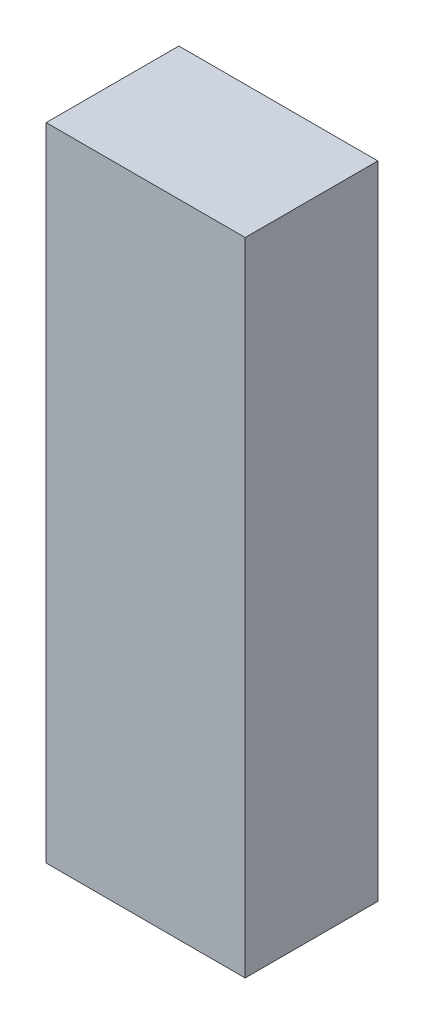
ISO-10303-21;
HEADER;
FILE_DESCRIPTION(('STEP AP214'),'2;1');
FILE_NAME('part.step','',(''),(''),'','','');
FILE_SCHEMA(('AUTOMOTIVE_DESIGN { 1 0 10303 214 1 1 1 1 }'));
ENDSEC;
DATA;
#1=APPLICATION_CONTEXT('core data for automotive mechanical design processes');
#2=APPLICATION_PROTOCOL_DEFINITION('international standard','automotive_design',2000,#1);
#3=PRODUCT_CONTEXT('',#1,'mechanical');
#4=PRODUCT('Part','Part','',(#3));
#5=PRODUCT_RELATED_PRODUCT_CATEGORY('part','',(#4));
#6=PRODUCT_DEFINITION_FORMATION('','',#4);
#7=PRODUCT_DEFINITION_CONTEXT('part definition',#1,'design');
#8=PRODUCT_DEFINITION('design','',#6,#7);
#9=PRODUCT_DEFINITION_SHAPE('','',#8);
#10=(LENGTH_UNIT() NAMED_UNIT(*) SI_UNIT(.MILLI.,.METRE.));
#11=(NAMED_UNIT(*) PLANE_ANGLE_UNIT() SI_UNIT($,.RADIAN.));
#12=(NAMED_UNIT(*) SI_UNIT($,.STERADIAN.) SOLID_ANGLE_UNIT());
#13=UNCERTAINTY_MEASURE_WITH_UNIT(LENGTH_MEASURE(1.E-05),#10,'distance_accuracy_value','');
#14=(GEOMETRIC_REPRESENTATION_CONTEXT(3) GLOBAL_UNCERTAINTY_ASSIGNED_CONTEXT((#13)) GLOBAL_UNIT_ASSIGNED_CONTEXT((#10,
#11,#12)) REPRESENTATION_CONTEXT('',''));
#15=CARTESIAN_POINT('',(0.,0.,0.));
#16=DIRECTION('',(0.,0.,1.));
#17=DIRECTION('',(1.,0.,0.));
#18=AXIS2_PLACEMENT_3D('',#15,#16,#17);
#19=CARTESIAN_POINT('',(22.5,145.,-15.));
#20=DIRECTION('',(-1.,0.,0.));
#21=DIRECTION('',(0.,0.,1.));
#22=AXIS2_PLACEMENT_3D('',#19,#20,#21);
#23=PLANE('',#22);
#24=DIRECTION('',(0.,0.,-1.));
#25=VECTOR('',#24,1.);
#26=CARTESIAN_POINT('',(22.5,0.,-15.));
#27=LINE('',#26,#25);
#28=CARTESIAN_POINT('',(22.5,0.,15.));
#29=VERTEX_POINT('',#28);
#30=CARTESIAN_POINT('',(22.5,0.,-15.));
#31=VERTEX_POINT('',#30);
#32=EDGE_CURVE('E97',#29,#31,#27,.T.);
#33=ORIENTED_EDGE('',*,*,#32,.T.);
#34=DIRECTION('',(0.,-1.,0.));
#35=VECTOR('',#34,1.);
#36=CARTESIAN_POINT('',(22.5,145.,-15.));
#37=LINE('',#36,#35);
#38=CARTESIAN_POINT('',(22.5,145.,-15.));
#39=VERTEX_POINT('',#38);
#40=EDGE_CURVE('E11',#39,#31,#37,.T.);
#41=ORIENTED_EDGE('',*,*,#40,.F.);
#42=DIRECTION('',(0.,0.,-1.));
#43=VECTOR('',#42,1.);
#44=CARTESIAN_POINT('',(22.5,145.,-15.));
#45=LINE('',#44,#43);
#46=CARTESIAN_POINT('',(22.5,145.,15.));
#47=VERTEX_POINT('',#46);
#48=EDGE_CURVE('E85',#47,#39,#45,.T.);
#49=ORIENTED_EDGE('',*,*,#48,.F.);
#50=DIRECTION('',(0.,-1.,0.));
#51=VECTOR('',#50,1.);
#52=CARTESIAN_POINT('',(22.5,145.,15.));
#53=LINE('',#52,#51);
#54=EDGE_CURVE('E93',#47,#29,#53,.T.);
#55=ORIENTED_EDGE('',*,*,#54,.T.);
#56=EDGE_LOOP('',(#33,#41,#49,#55));
#57=FACE_BOUND('',#56,.T.);
#58=ADVANCED_FACE('F34',(#57),#23,.F.);
#59=CARTESIAN_POINT('',(-22.5,145.,-15.));
#60=DIRECTION('',(0.,0.,1.));
#61=DIRECTION('',(1.,0.,0.));
#62=AXIS2_PLACEMENT_3D('',#59,#60,#61);
#63=PLANE('',#62);
#64=DIRECTION('',(-1.,0.,0.));
#65=VECTOR('',#64,1.);
#66=CARTESIAN_POINT('',(-22.5,0.,-15.));
#67=LINE('',#66,#65);
#68=CARTESIAN_POINT('',(-22.5,0.,-15.));
#69=VERTEX_POINT('',#68);
#70=EDGE_CURVE('E89',#31,#69,#67,.T.);
#71=ORIENTED_EDGE('',*,*,#70,.T.);
#72=DIRECTION('',(0.,-1.,0.));
#73=VECTOR('',#72,1.);
#74=CARTESIAN_POINT('',(-22.5,145.,-15.));
#75=LINE('',#74,#73);
#76=CARTESIAN_POINT('',(-22.5,145.,-15.));
#77=VERTEX_POINT('',#76);
#78=EDGE_CURVE('E42',#77,#69,#75,.T.);
#79=ORIENTED_EDGE('',*,*,#78,.F.);
#80=DIRECTION('',(-1.,0.,0.));
#81=VECTOR('',#80,1.);
#82=CARTESIAN_POINT('',(-22.5,145.,-15.));
#83=LINE('',#82,#81);
#84=EDGE_CURVE('E80',#39,#77,#83,.T.);
#85=ORIENTED_EDGE('',*,*,#84,.F.);
#86=ORIENTED_EDGE('',*,*,#40,.T.);
#87=EDGE_LOOP('',(#71,#79,#85,#86));
#88=FACE_BOUND('',#87,.T.);
#89=ADVANCED_FACE('F88',(#88),#63,.F.);
#90=CARTESIAN_POINT('',(-22.5,145.,-15.));
#91=DIRECTION('',(1.,0.,0.));
#92=DIRECTION('',(0.,0.,-1.));
#93=AXIS2_PLACEMENT_3D('',#90,#91,#92);
#94=PLANE('',#93);
#95=DIRECTION('',(0.,0.,1.));
#96=VECTOR('',#95,1.);
#97=CARTESIAN_POINT('',(-22.5,0.,-15.));
#98=LINE('',#97,#96);
#99=CARTESIAN_POINT('',(-22.5,0.,15.));
#100=VERTEX_POINT('',#99);
#101=EDGE_CURVE('E67',#69,#100,#98,.T.);
#102=ORIENTED_EDGE('',*,*,#101,.T.);
#103=DIRECTION('',(0.,-1.,0.));
#104=VECTOR('',#103,1.);
#105=CARTESIAN_POINT('',(-22.5,145.,15.));
#106=LINE('',#105,#104);
#107=CARTESIAN_POINT('',(-22.5,145.,15.));
#108=VERTEX_POINT('',#107);
#109=EDGE_CURVE('E90',#108,#100,#106,.T.);
#110=ORIENTED_EDGE('',*,*,#109,.F.);
#111=DIRECTION('',(0.,0.,1.));
#112=VECTOR('',#111,1.);
#113=CARTESIAN_POINT('',(-22.5,145.,-15.));
#114=LINE('',#113,#112);
#115=EDGE_CURVE('E83',#77,#108,#114,.T.);
#116=ORIENTED_EDGE('',*,*,#115,.F.);
#117=ORIENTED_EDGE('',*,*,#78,.T.);
#118=EDGE_LOOP('',(#102,#110,#116,#117));
#119=FACE_BOUND('',#118,.T.);
#120=ADVANCED_FACE('F91',(#119),#94,.F.);
#121=CARTESIAN_POINT('',(-22.5,145.,15.));
#122=DIRECTION('',(0.,0.,-1.));
#123=DIRECTION('',(-1.,0.,0.));
#124=AXIS2_PLACEMENT_3D('',#121,#122,#123);
#125=PLANE('',#124);
#126=DIRECTION('',(1.,0.,0.));
#127=VECTOR('',#126,1.);
#128=CARTESIAN_POINT('',(-22.5,0.,15.));
#129=LINE('',#128,#127);
#130=EDGE_CURVE('E73',#100,#29,#129,.T.);
#131=ORIENTED_EDGE('',*,*,#130,.T.);
#132=ORIENTED_EDGE('',*,*,#54,.F.);
#133=DIRECTION('',(1.,0.,0.));
#134=VECTOR('',#133,1.);
#135=CARTESIAN_POINT('',(-22.5,145.,15.));
#136=LINE('',#135,#134);
#137=EDGE_CURVE('E50',#108,#47,#136,.T.);
#138=ORIENTED_EDGE('',*,*,#137,.F.);
#139=ORIENTED_EDGE('',*,*,#109,.T.);
#140=EDGE_LOOP('',(#131,#132,#138,#139));
#141=FACE_BOUND('',#140,.T.);
#142=ADVANCED_FACE('F104',(#141),#125,.F.);
#143=CARTESIAN_POINT('',(0.,145.,0.));
#144=DIRECTION('',(0.,1.,0.));
#145=DIRECTION('',(0.,0.,1.));
#146=AXIS2_PLACEMENT_3D('',#143,#144,#145);
#147=PLANE('',#146);
#148=ORIENTED_EDGE('',*,*,#48,.T.);
#149=ORIENTED_EDGE('',*,*,#84,.T.);
#150=ORIENTED_EDGE('',*,*,#115,.T.);
#151=ORIENTED_EDGE('',*,*,#137,.T.);
#152=EDGE_LOOP('',(#148,#149,#150,#151));
#153=FACE_BOUND('',#152,.T.);
#154=ADVANCED_FACE('F81',(#153),#147,.T.);
#155=CARTESIAN_POINT('',(0.,0.,0.));
#156=DIRECTION('',(0.,1.,0.));
#157=DIRECTION('',(0.,0.,1.));
#158=AXIS2_PLACEMENT_3D('',#155,#156,#157);
#159=PLANE('',#158);
#160=ORIENTED_EDGE('',*,*,#32,.F.);
#161=ORIENTED_EDGE('',*,*,#130,.F.);
#162=ORIENTED_EDGE('',*,*,#101,.F.);
#163=ORIENTED_EDGE('',*,*,#70,.F.);
#164=EDGE_LOOP('',(#160,#161,#162,#163));
#165=FACE_BOUND('',#164,.T.);
#166=ADVANCED_FACE('F107',(#165),#159,.F.);
#167=CLOSED_SHELL('',(#58,#89,#120,#142,#154,#166));
#168=MANIFOLD_SOLID_BREP('B2',#167);
#169=ADVANCED_BREP_SHAPE_REPRESENTATION('',(#18,#168),#14);
#170=SHAPE_DEFINITION_REPRESENTATION(#9,#169);
ENDSEC;
END-ISO-10303-21;
